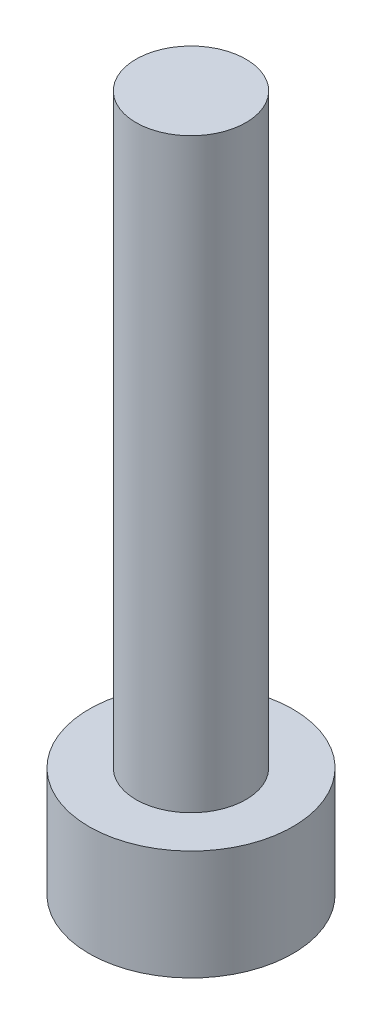
ISO-10303-21;
HEADER;
FILE_DESCRIPTION(('STEP AP214'),'2;1');
FILE_NAME('part.step','',(''),(''),'','','');
FILE_SCHEMA(('AUTOMOTIVE_DESIGN { 1 0 10303 214 1 1 1 1 }'));
ENDSEC;
DATA;
#1=APPLICATION_CONTEXT('core data for automotive mechanical design processes');
#2=APPLICATION_PROTOCOL_DEFINITION('international standard','automotive_design',2000,#1);
#3=PRODUCT_CONTEXT('',#1,'mechanical');
#4=PRODUCT('Part','Part','',(#3));
#5=PRODUCT_RELATED_PRODUCT_CATEGORY('part','',(#4));
#6=PRODUCT_DEFINITION_FORMATION('','',#4);
#7=PRODUCT_DEFINITION_CONTEXT('part definition',#1,'design');
#8=PRODUCT_DEFINITION('design','',#6,#7);
#9=PRODUCT_DEFINITION_SHAPE('','',#8);
#10=(LENGTH_UNIT() NAMED_UNIT(*) SI_UNIT(.MILLI.,.METRE.));
#11=(NAMED_UNIT(*) PLANE_ANGLE_UNIT() SI_UNIT($,.RADIAN.));
#12=(NAMED_UNIT(*) SI_UNIT($,.STERADIAN.) SOLID_ANGLE_UNIT());
#13=UNCERTAINTY_MEASURE_WITH_UNIT(LENGTH_MEASURE(1.E-05),#10,'distance_accuracy_value','');
#14=(GEOMETRIC_REPRESENTATION_CONTEXT(3) GLOBAL_UNCERTAINTY_ASSIGNED_CONTEXT((#13)) GLOBAL_UNIT_ASSIGNED_CONTEXT((#10,
#11,#12)) REPRESENTATION_CONTEXT('',''));
#15=CARTESIAN_POINT('',(0.,0.,0.));
#16=DIRECTION('',(0.,0.,1.));
#17=DIRECTION('',(1.,0.,0.));
#18=AXIS2_PLACEMENT_3D('',#15,#16,#17);
#19=CARTESIAN_POINT('',(0.,3.,0.));
#20=DIRECTION('',(0.,-1.,0.));
#21=DIRECTION('',(0.,0.,-1.));
#22=AXIS2_PLACEMENT_3D('',#19,#20,#21);
#23=CYLINDRICAL_SURFACE('',#22,2.78);
#24=CARTESIAN_POINT('',(0.,3.,0.));
#25=DIRECTION('',(0.,1.,0.));
#26=DIRECTION('',(0.,0.,1.));
#27=AXIS2_PLACEMENT_3D('',#24,#25,#26);
#28=CIRCLE('',#27,2.78);
#29=CARTESIAN_POINT('',(0.,3.,2.78));
#30=VERTEX_POINT('',#29);
#31=EDGE_CURVE('E10',#30,#30,#28,.T.);
#32=ORIENTED_EDGE('',*,*,#31,.F.);
#33=EDGE_LOOP('',(#32));
#34=FACE_BOUND('',#33,.T.);
#35=CARTESIAN_POINT('',(0.,0.,0.));
#36=DIRECTION('',(0.,1.,0.));
#37=DIRECTION('',(0.,0.,1.));
#38=AXIS2_PLACEMENT_3D('',#35,#36,#37);
#39=CIRCLE('',#38,2.78);
#40=CARTESIAN_POINT('',(0.,0.,2.78));
#41=VERTEX_POINT('',#40);
#42=EDGE_CURVE('E34',#41,#41,#39,.T.);
#43=ORIENTED_EDGE('',*,*,#42,.T.);
#44=EDGE_LOOP('',(#43));
#45=FACE_BOUND('',#44,.T.);
#46=ADVANCED_FACE('F31',(#34,#45),#23,.T.);
#47=CARTESIAN_POINT('',(0.,3.,0.));
#48=DIRECTION('',(0.,1.,0.));
#49=DIRECTION('',(0.,0.,1.));
#50=AXIS2_PLACEMENT_3D('',#47,#48,#49);
#51=PLANE('',#50);
#52=CARTESIAN_POINT('',(0.,3.,0.));
#53=DIRECTION('',(0.,1.,0.));
#54=DIRECTION('',(0.,0.,1.));
#55=AXIS2_PLACEMENT_3D('',#52,#53,#54);
#56=CIRCLE('',#55,1.5);
#57=CARTESIAN_POINT('',(0.,3.,1.5));
#58=VERTEX_POINT('',#57);
#59=EDGE_CURVE('E43',#58,#58,#56,.T.);
#60=ORIENTED_EDGE('',*,*,#59,.F.);
#61=EDGE_LOOP('',(#60));
#62=FACE_BOUND('',#61,.T.);
#63=ORIENTED_EDGE('',*,*,#31,.T.);
#64=EDGE_LOOP('',(#63));
#65=FACE_BOUND('',#64,.T.);
#66=ADVANCED_FACE('F58',(#62,#65),#51,.T.);
#67=CARTESIAN_POINT('',(0.,0.,0.));
#68=DIRECTION('',(0.,1.,0.));
#69=DIRECTION('',(0.,0.,1.));
#70=AXIS2_PLACEMENT_3D('',#67,#68,#69);
#71=PLANE('',#70);
#72=ORIENTED_EDGE('',*,*,#42,.F.);
#73=EDGE_LOOP('',(#72));
#74=FACE_BOUND('',#73,.T.);
#75=ADVANCED_FACE('F54',(#74),#71,.F.);
#76=CARTESIAN_POINT('',(0.,19.,0.));
#77=DIRECTION('',(0.,-1.,0.));
#78=DIRECTION('',(0.,0.,-1.));
#79=AXIS2_PLACEMENT_3D('',#76,#77,#78);
#80=CYLINDRICAL_SURFACE('',#79,1.5);
#81=CARTESIAN_POINT('',(0.,19.,0.));
#82=DIRECTION('',(0.,1.,0.));
#83=DIRECTION('',(0.,0.,1.));
#84=AXIS2_PLACEMENT_3D('',#81,#82,#83);
#85=CIRCLE('',#84,1.5);
#86=CARTESIAN_POINT('',(0.,19.,1.5));
#87=VERTEX_POINT('',#86);
#88=EDGE_CURVE('E41',#87,#87,#85,.T.);
#89=ORIENTED_EDGE('',*,*,#88,.F.);
#90=EDGE_LOOP('',(#89));
#91=FACE_BOUND('',#90,.T.);
#92=ORIENTED_EDGE('',*,*,#59,.T.);
#93=EDGE_LOOP('',(#92));
#94=FACE_BOUND('',#93,.T.);
#95=ADVANCED_FACE('F51',(#91,#94),#80,.T.);
#96=CARTESIAN_POINT('',(0.,19.,0.));
#97=DIRECTION('',(0.,1.,0.));
#98=DIRECTION('',(0.,0.,1.));
#99=AXIS2_PLACEMENT_3D('',#96,#97,#98);
#100=PLANE('',#99);
#101=ORIENTED_EDGE('',*,*,#88,.T.);
#102=EDGE_LOOP('',(#101));
#103=FACE_BOUND('',#102,.T.);
#104=ADVANCED_FACE('F49',(#103),#100,.T.);
#105=CLOSED_SHELL('',(#46,#66,#75,#95,#104));
#106=MANIFOLD_SOLID_BREP('B2',#105);
#107=ADVANCED_BREP_SHAPE_REPRESENTATION('',(#18,#106),#14);
#108=SHAPE_DEFINITION_REPRESENTATION(#9,#107);
ENDSEC;
END-ISO-10303-21;
